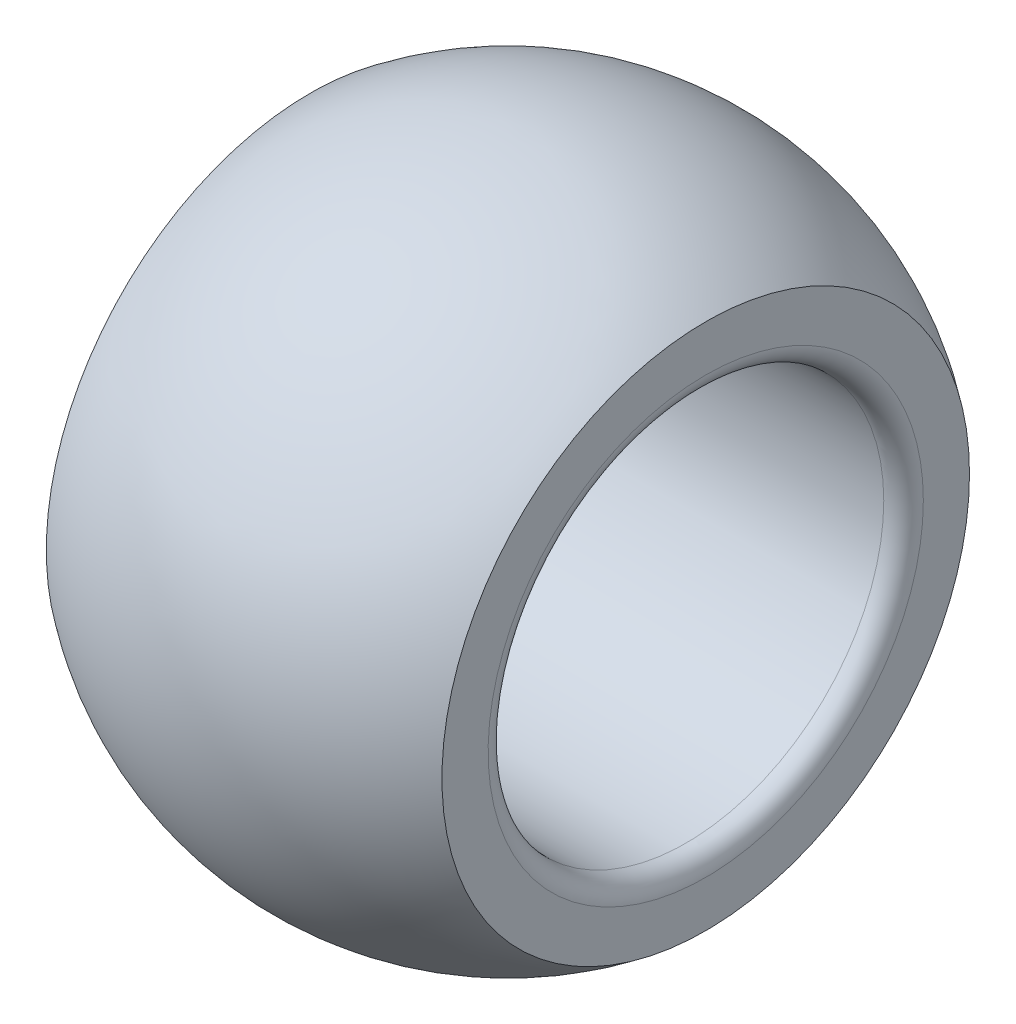
ISO-10303-21;
HEADER;
FILE_DESCRIPTION(('STEP AP214'),'2;1');
FILE_NAME('part.step','',(''),(''),'','','');
FILE_SCHEMA(('AUTOMOTIVE_DESIGN { 1 0 10303 214 1 1 1 1 }'));
ENDSEC;
DATA;
#1=APPLICATION_CONTEXT('core data for automotive mechanical design processes');
#2=APPLICATION_PROTOCOL_DEFINITION('international standard','automotive_design',2000,#1);
#3=PRODUCT_CONTEXT('',#1,'mechanical');
#4=PRODUCT('Part','Part','',(#3));
#5=PRODUCT_RELATED_PRODUCT_CATEGORY('part','',(#4));
#6=PRODUCT_DEFINITION_FORMATION('','',#4);
#7=PRODUCT_DEFINITION_CONTEXT('part definition',#1,'design');
#8=PRODUCT_DEFINITION('design','',#6,#7);
#9=PRODUCT_DEFINITION_SHAPE('','',#8);
#10=(LENGTH_UNIT() NAMED_UNIT(*) SI_UNIT(.MILLI.,.METRE.));
#11=(NAMED_UNIT(*) PLANE_ANGLE_UNIT() SI_UNIT($,.RADIAN.));
#12=(NAMED_UNIT(*) SI_UNIT($,.STERADIAN.) SOLID_ANGLE_UNIT());
#13=UNCERTAINTY_MEASURE_WITH_UNIT(LENGTH_MEASURE(1.E-05),#10,'distance_accuracy_value','');
#14=(GEOMETRIC_REPRESENTATION_CONTEXT(3) GLOBAL_UNCERTAINTY_ASSIGNED_CONTEXT((#13)) GLOBAL_UNIT_ASSIGNED_CONTEXT((#10,
#11,#12)) REPRESENTATION_CONTEXT('',''));
#15=CARTESIAN_POINT('',(0.,0.,0.));
#16=DIRECTION('',(0.,0.,1.));
#17=DIRECTION('',(1.,0.,0.));
#18=AXIS2_PLACEMENT_3D('',#15,#16,#17);
#19=CARTESIAN_POINT('',(0.,0.,0.));
#20=DIRECTION('',(1.,0.,0.));
#21=DIRECTION('',(0.,0.,-1.));
#22=AXIS2_PLACEMENT_3D('',#19,#20,#21);
#23=CYLINDRICAL_SURFACE('',#22,3.);
#24=CARTESIAN_POINT('',(-2.7,0.,0.));
#25=DIRECTION('',(1.,0.,0.));
#26=DIRECTION('',(0.,0.,-1.));
#27=AXIS2_PLACEMENT_3D('',#24,#25,#26);
#28=CIRCLE('',#27,3.);
#29=CARTESIAN_POINT('',(-2.7,0.,-3.));
#30=VERTEX_POINT('',#29);
#31=EDGE_CURVE('E55',#30,#30,#28,.T.);
#32=ORIENTED_EDGE('',*,*,#31,.F.);
#33=EDGE_LOOP('',(#32));
#34=FACE_BOUND('',#33,.T.);
#35=CARTESIAN_POINT('',(2.7,0.,0.));
#36=DIRECTION('',(1.,0.,0.));
#37=DIRECTION('',(0.,0.,-1.));
#38=AXIS2_PLACEMENT_3D('',#35,#36,#37);
#39=CIRCLE('',#38,3.);
#40=CARTESIAN_POINT('',(2.7,0.,-3.));
#41=VERTEX_POINT('',#40);
#42=EDGE_CURVE('E53',#41,#41,#39,.F.);
#43=ORIENTED_EDGE('',*,*,#42,.F.);
#44=EDGE_LOOP('',(#43));
#45=FACE_BOUND('',#44,.T.);
#46=ADVANCED_FACE('F15',(#34,#45),#23,.F.);
#47=CARTESIAN_POINT('',(2.7,0.,0.));
#48=DIRECTION('',(1.,0.,0.));
#49=DIRECTION('',(0.,0.,-1.));
#50=AXIS2_PLACEMENT_3D('',#47,#48,#49);
#51=TOROIDAL_SURFACE('',#50,3.3,0.3);
#52=ORIENTED_EDGE('',*,*,#42,.T.);
#53=EDGE_LOOP('',(#52));
#54=FACE_BOUND('',#53,.T.);
#55=CARTESIAN_POINT('',(3.,0.,0.));
#56=DIRECTION('',(1.,0.,0.));
#57=DIRECTION('',(0.,1.,0.));
#58=AXIS2_PLACEMENT_3D('',#55,#56,#57);
#59=CIRCLE('',#58,3.3);
#60=CARTESIAN_POINT('',(3.,3.3,0.));
#61=VERTEX_POINT('',#60);
#62=EDGE_CURVE('E59',#61,#61,#59,.F.);
#63=ORIENTED_EDGE('',*,*,#62,.F.);
#64=EDGE_LOOP('',(#63));
#65=FACE_BOUND('',#64,.T.);
#66=ADVANCED_FACE('F32',(#54,#65),#51,.T.);
#67=CARTESIAN_POINT('',(-2.7,0.,0.));
#68=DIRECTION('',(1.,0.,0.));
#69=DIRECTION('',(0.,0.,-1.));
#70=AXIS2_PLACEMENT_3D('',#67,#68,#69);
#71=TOROIDAL_SURFACE('',#70,3.3,0.3);
#72=CARTESIAN_POINT('',(-3.,0.,0.));
#73=DIRECTION('',(-1.,0.,0.));
#74=DIRECTION('',(0.,1.,0.));
#75=AXIS2_PLACEMENT_3D('',#72,#73,#74);
#76=CIRCLE('',#75,3.3);
#77=CARTESIAN_POINT('',(-3.,3.3,0.));
#78=VERTEX_POINT('',#77);
#79=EDGE_CURVE('E25',#78,#78,#76,.F.);
#80=ORIENTED_EDGE('',*,*,#79,.F.);
#81=EDGE_LOOP('',(#80));
#82=FACE_BOUND('',#81,.T.);
#83=ORIENTED_EDGE('',*,*,#31,.T.);
#84=EDGE_LOOP('',(#83));
#85=FACE_BOUND('',#84,.T.);
#86=ADVANCED_FACE('F42',(#82,#85),#71,.T.);
#87=CARTESIAN_POINT('',(3.,3.5,0.));
#88=DIRECTION('',(1.,0.,0.));
#89=DIRECTION('',(0.,0.,-1.));
#90=AXIS2_PLACEMENT_3D('',#87,#88,#89);
#91=PLANE('',#90);
#92=ORIENTED_EDGE('',*,*,#62,.T.);
#93=EDGE_LOOP('',(#92));
#94=FACE_BOUND('',#93,.T.);
#95=CARTESIAN_POINT('',(3.,0.,0.));
#96=DIRECTION('',(1.,0.,0.));
#97=DIRECTION('',(0.,0.,-1.));
#98=AXIS2_PLACEMENT_3D('',#95,#96,#97);
#99=CIRCLE('',#98,4.);
#100=CARTESIAN_POINT('',(3.,0.,-4.));
#101=VERTEX_POINT('',#100);
#102=EDGE_CURVE('E18',#101,#101,#99,.F.);
#103=ORIENTED_EDGE('',*,*,#102,.F.);
#104=EDGE_LOOP('',(#103));
#105=FACE_BOUND('',#104,.T.);
#106=ADVANCED_FACE('F91',(#94,#105),#91,.T.);
#107=CARTESIAN_POINT('',(-3.,3.5,0.));
#108=DIRECTION('',(-1.,0.,0.));
#109=DIRECTION('',(0.,0.,1.));
#110=AXIS2_PLACEMENT_3D('',#107,#108,#109);
#111=PLANE('',#110);
#112=ORIENTED_EDGE('',*,*,#79,.T.);
#113=EDGE_LOOP('',(#112));
#114=FACE_BOUND('',#113,.T.);
#115=CARTESIAN_POINT('',(-3.,0.,0.));
#116=DIRECTION('',(1.,0.,0.));
#117=DIRECTION('',(0.,0.,-1.));
#118=AXIS2_PLACEMENT_3D('',#115,#116,#117);
#119=CIRCLE('',#118,4.);
#120=CARTESIAN_POINT('',(-3.,0.,-4.));
#121=VERTEX_POINT('',#120);
#122=EDGE_CURVE('E10',#121,#121,#119,.T.);
#123=ORIENTED_EDGE('',*,*,#122,.F.);
#124=EDGE_LOOP('',(#123));
#125=FACE_BOUND('',#124,.T.);
#126=ADVANCED_FACE('F73',(#114,#125),#111,.T.);
#127=CARTESIAN_POINT('',(0.,0.,0.));
#128=DIRECTION('',(1.,0.,0.));
#129=DIRECTION('',(0.,1.,0.));
#130=AXIS2_PLACEMENT_3D('',#127,#128,#129);
#131=SPHERICAL_SURFACE('',#130,5.);
#132=ORIENTED_EDGE('',*,*,#122,.T.);
#133=EDGE_LOOP('',(#132));
#134=FACE_BOUND('',#133,.T.);
#135=ORIENTED_EDGE('',*,*,#102,.T.);
#136=EDGE_LOOP('',(#135));
#137=FACE_BOUND('',#136,.T.);
#138=ADVANCED_FACE('F90',(#134,#137),#131,.T.);
#139=CLOSED_SHELL('',(#46,#66,#86,#106,#126,#138));
#140=MANIFOLD_SOLID_BREP('B1',#139);
#141=ADVANCED_BREP_SHAPE_REPRESENTATION('',(#18,#140),#14);
#142=SHAPE_DEFINITION_REPRESENTATION(#9,#141);
ENDSEC;
END-ISO-10303-21;
